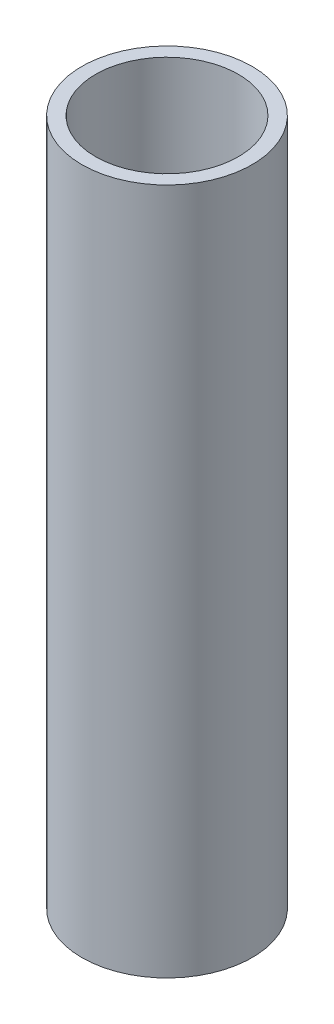
ISO-10303-21;
HEADER;
FILE_DESCRIPTION(('STEP AP214'),'2;1');
FILE_NAME('part.step','',(''),(''),'','','');
FILE_SCHEMA(('AUTOMOTIVE_DESIGN { 1 0 10303 214 1 1 1 1 }'));
ENDSEC;
DATA;
#1=APPLICATION_CONTEXT('core data for automotive mechanical design processes');
#2=APPLICATION_PROTOCOL_DEFINITION('international standard','automotive_design',2000,#1);
#3=PRODUCT_CONTEXT('',#1,'mechanical');
#4=PRODUCT('Part','Part','',(#3));
#5=PRODUCT_RELATED_PRODUCT_CATEGORY('part','',(#4));
#6=PRODUCT_DEFINITION_FORMATION('','',#4);
#7=PRODUCT_DEFINITION_CONTEXT('part definition',#1,'design');
#8=PRODUCT_DEFINITION('design','',#6,#7);
#9=PRODUCT_DEFINITION_SHAPE('','',#8);
#10=(LENGTH_UNIT() NAMED_UNIT(*) SI_UNIT(.MILLI.,.METRE.));
#11=(NAMED_UNIT(*) PLANE_ANGLE_UNIT() SI_UNIT($,.RADIAN.));
#12=(NAMED_UNIT(*) SI_UNIT($,.STERADIAN.) SOLID_ANGLE_UNIT());
#13=UNCERTAINTY_MEASURE_WITH_UNIT(LENGTH_MEASURE(1.E-05),#10,'distance_accuracy_value','');
#14=(GEOMETRIC_REPRESENTATION_CONTEXT(3) GLOBAL_UNCERTAINTY_ASSIGNED_CONTEXT((#13)) GLOBAL_UNIT_ASSIGNED_CONTEXT((#10,
#11,#12)) REPRESENTATION_CONTEXT('',''));
#15=CARTESIAN_POINT('',(0.,0.,0.));
#16=DIRECTION('',(0.,0.,1.));
#17=DIRECTION('',(1.,0.,0.));
#18=AXIS2_PLACEMENT_3D('',#15,#16,#17);
#19=CARTESIAN_POINT('',(0.,100.,0.));
#20=DIRECTION('',(0.,1.,0.));
#21=DIRECTION('',(0.,0.,1.));
#22=AXIS2_PLACEMENT_3D('',#19,#20,#21);
#23=PLANE('',#22);
#24=CARTESIAN_POINT('',(0.,100.,0.));
#25=DIRECTION('',(0.,1.,0.));
#26=DIRECTION('',(0.,0.,1.));
#27=AXIS2_PLACEMENT_3D('',#24,#25,#26);
#28=CIRCLE('',#27,12.4);
#29=CARTESIAN_POINT('',(0.,100.,12.4));
#30=VERTEX_POINT('',#29);
#31=EDGE_CURVE('E10',#30,#30,#28,.T.);
#32=ORIENTED_EDGE('',*,*,#31,.T.);
#33=EDGE_LOOP('',(#32));
#34=FACE_BOUND('',#33,.T.);
#35=CARTESIAN_POINT('',(0.,100.,0.));
#36=DIRECTION('',(0.,1.,0.));
#37=DIRECTION('',(0.,0.,1.));
#38=AXIS2_PLACEMENT_3D('',#35,#36,#37);
#39=CIRCLE('',#38,10.4);
#40=CARTESIAN_POINT('',(0.,100.,10.4));
#41=VERTEX_POINT('',#40);
#42=EDGE_CURVE('E48',#41,#41,#39,.T.);
#43=ORIENTED_EDGE('',*,*,#42,.F.);
#44=EDGE_LOOP('',(#43));
#45=FACE_BOUND('',#44,.T.);
#46=ADVANCED_FACE('F37',(#34,#45),#23,.T.);
#47=CARTESIAN_POINT('',(0.,0.,0.));
#48=DIRECTION('',(0.,1.,0.));
#49=DIRECTION('',(0.,0.,1.));
#50=AXIS2_PLACEMENT_3D('',#47,#48,#49);
#51=PLANE('',#50);
#52=CARTESIAN_POINT('',(0.,0.,0.));
#53=DIRECTION('',(0.,1.,0.));
#54=DIRECTION('',(0.,0.,1.));
#55=AXIS2_PLACEMENT_3D('',#52,#53,#54);
#56=CIRCLE('',#55,12.4);
#57=CARTESIAN_POINT('',(0.,0.,12.4));
#58=VERTEX_POINT('',#57);
#59=EDGE_CURVE('E41',#58,#58,#56,.T.);
#60=ORIENTED_EDGE('',*,*,#59,.F.);
#61=EDGE_LOOP('',(#60));
#62=FACE_BOUND('',#61,.T.);
#63=CARTESIAN_POINT('',(0.,0.,0.));
#64=DIRECTION('',(0.,1.,0.));
#65=DIRECTION('',(0.,0.,1.));
#66=AXIS2_PLACEMENT_3D('',#63,#64,#65);
#67=CIRCLE('',#66,10.4);
#68=CARTESIAN_POINT('',(0.,0.,10.4));
#69=VERTEX_POINT('',#68);
#70=EDGE_CURVE('E50',#69,#69,#67,.T.);
#71=ORIENTED_EDGE('',*,*,#70,.T.);
#72=EDGE_LOOP('',(#71));
#73=FACE_BOUND('',#72,.T.);
#74=ADVANCED_FACE('F60',(#62,#73),#51,.F.);
#75=CARTESIAN_POINT('',(0.,100.,0.));
#76=DIRECTION('',(0.,-1.,0.));
#77=DIRECTION('',(0.,0.,-1.));
#78=AXIS2_PLACEMENT_3D('',#75,#76,#77);
#79=CYLINDRICAL_SURFACE('',#78,12.4);
#80=ORIENTED_EDGE('',*,*,#31,.F.);
#81=EDGE_LOOP('',(#80));
#82=FACE_BOUND('',#81,.T.);
#83=ORIENTED_EDGE('',*,*,#59,.T.);
#84=EDGE_LOOP('',(#83));
#85=FACE_BOUND('',#84,.T.);
#86=ADVANCED_FACE('F39',(#82,#85),#79,.T.);
#87=CARTESIAN_POINT('',(0.,100.,0.));
#88=DIRECTION('',(0.,-1.,0.));
#89=DIRECTION('',(0.,0.,-1.));
#90=AXIS2_PLACEMENT_3D('',#87,#88,#89);
#91=CYLINDRICAL_SURFACE('',#90,10.4);
#92=ORIENTED_EDGE('',*,*,#42,.T.);
#93=EDGE_LOOP('',(#92));
#94=FACE_BOUND('',#93,.T.);
#95=ORIENTED_EDGE('',*,*,#70,.F.);
#96=EDGE_LOOP('',(#95));
#97=FACE_BOUND('',#96,.T.);
#98=ADVANCED_FACE('F56',(#94,#97),#91,.F.);
#99=CLOSED_SHELL('',(#46,#74,#86,#98));
#100=MANIFOLD_SOLID_BREP('B2',#99);
#101=ADVANCED_BREP_SHAPE_REPRESENTATION('',(#18,#100),#14);
#102=SHAPE_DEFINITION_REPRESENTATION(#9,#101);
ENDSEC;
END-ISO-10303-21;
